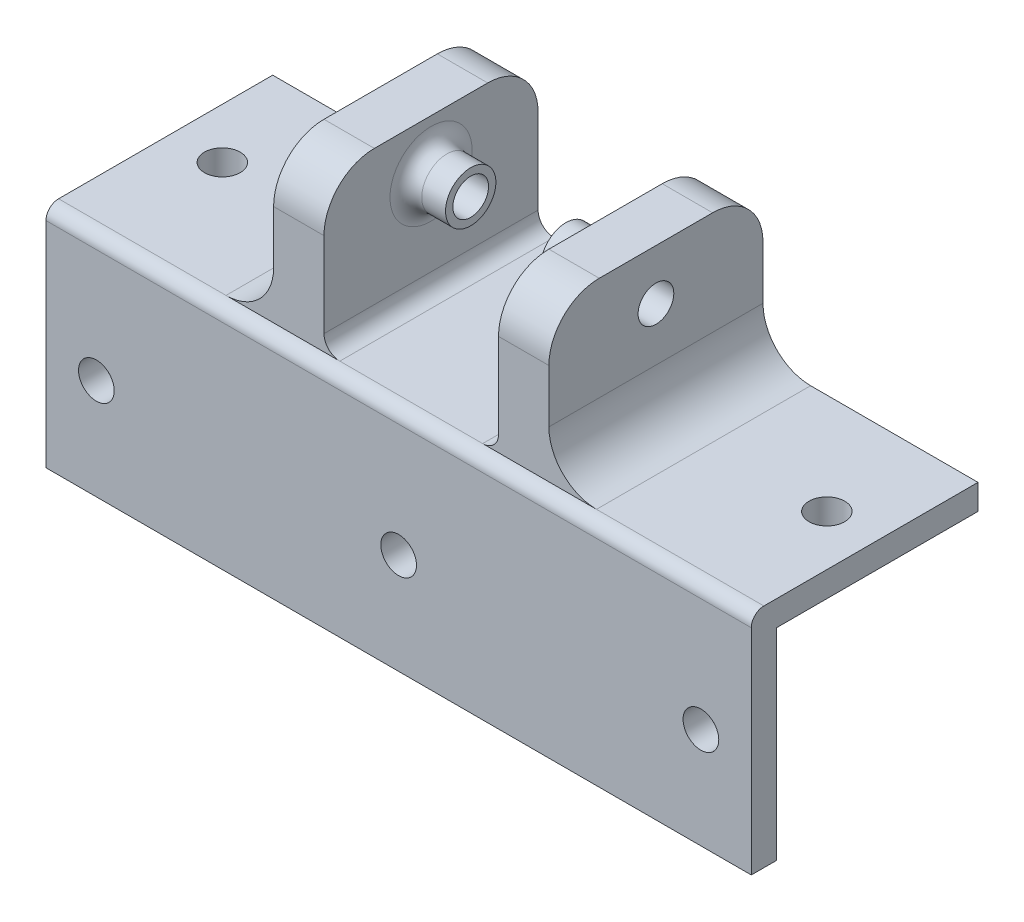
ISO-10303-21;
HEADER;
FILE_DESCRIPTION(('STEP AP214'),'2;1');
FILE_NAME('part.step','',(''),(''),'','','');
FILE_SCHEMA(('AUTOMOTIVE_DESIGN { 1 0 10303 214 1 1 1 1 }'));
ENDSEC;
DATA;
#1=APPLICATION_CONTEXT('core data for automotive mechanical design processes');
#2=APPLICATION_PROTOCOL_DEFINITION('international standard','automotive_design',2000,#1);
#3=PRODUCT_CONTEXT('',#1,'mechanical');
#4=PRODUCT('Part','Part','',(#3));
#5=PRODUCT_RELATED_PRODUCT_CATEGORY('part','',(#4));
#6=PRODUCT_DEFINITION_FORMATION('','',#4);
#7=PRODUCT_DEFINITION_CONTEXT('part definition',#1,'design');
#8=PRODUCT_DEFINITION('design','',#6,#7);
#9=PRODUCT_DEFINITION_SHAPE('','',#8);
#10=(LENGTH_UNIT() NAMED_UNIT(*) SI_UNIT(.MILLI.,.METRE.));
#11=(NAMED_UNIT(*) PLANE_ANGLE_UNIT() SI_UNIT($,.RADIAN.));
#12=(NAMED_UNIT(*) SI_UNIT($,.STERADIAN.) SOLID_ANGLE_UNIT());
#13=UNCERTAINTY_MEASURE_WITH_UNIT(LENGTH_MEASURE(1.E-05),#10,'distance_accuracy_value','');
#14=(GEOMETRIC_REPRESENTATION_CONTEXT(3) GLOBAL_UNCERTAINTY_ASSIGNED_CONTEXT((#13)) GLOBAL_UNIT_ASSIGNED_CONTEXT((#10,
#11,#12)) REPRESENTATION_CONTEXT('',''));
#15=CARTESIAN_POINT('',(0.,0.,0.));
#16=DIRECTION('',(0.,0.,1.));
#17=DIRECTION('',(1.,0.,0.));
#18=AXIS2_PLACEMENT_3D('',#15,#16,#17);
#19=CARTESIAN_POINT('',(-11.,34.925,0.));
#20=DIRECTION('',(1.,0.,0.));
#21=DIRECTION('',(0.,0.,-1.));
#22=AXIS2_PLACEMENT_3D('',#19,#20,#21);
#23=PLANE('',#22);
#24=CARTESIAN_POINT('',(-11.,28.575,-11.90625));
#25=DIRECTION('',(1.,0.,0.));
#26=DIRECTION('',(0.,0.,-1.));
#27=AXIS2_PLACEMENT_3D('',#24,#25,#26);
#28=CIRCLE('',#27,5.175);
#29=CARTESIAN_POINT('',(-11.,28.575,-17.08125));
#30=VERTEX_POINT('',#29);
#31=EDGE_CURVE('E496',#30,#30,#28,.F.);
#32=ORIENTED_EDGE('',*,*,#31,.T.);
#33=EDGE_LOOP('',(#32));
#34=FACE_BOUND('',#33,.T.);
#35=DIRECTION('',(0.,-1.,0.));
#36=VECTOR('',#35,1.);
#37=CARTESIAN_POINT('',(-11.,34.925,1.5875));
#38=LINE('',#37,#36);
#39=CARTESIAN_POINT('',(-11.,28.575,1.5875));
#40=VERTEX_POINT('',#39);
#41=CARTESIAN_POINT('',(-11.,17.875,1.5875));
#42=VERTEX_POINT('',#41);
#43=EDGE_CURVE('E273',#40,#42,#38,.T.);
#44=ORIENTED_EDGE('',*,*,#43,.T.);
#45=DIRECTION('',(0.,0.,1.));
#46=VECTOR('',#45,1.);
#47=CARTESIAN_POINT('',(-11.,17.875,0.));
#48=LINE('',#47,#46);
#49=CARTESIAN_POINT('',(-11.,17.875,-25.4));
#50=VERTEX_POINT('',#49);
#51=EDGE_CURVE('E468',#42,#50,#48,.F.);
#52=ORIENTED_EDGE('',*,*,#51,.T.);
#53=DIRECTION('',(0.,-1.,0.));
#54=VECTOR('',#53,1.);
#55=CARTESIAN_POINT('',(-11.,34.925,-25.4));
#56=LINE('',#55,#54);
#57=CARTESIAN_POINT('',(-11.,28.575,-25.4));
#58=VERTEX_POINT('',#57);
#59=EDGE_CURVE('E276',#58,#50,#56,.T.);
#60=ORIENTED_EDGE('',*,*,#59,.F.);
#61=CARTESIAN_POINT('',(-11.,28.575,-19.05));
#62=DIRECTION('',(1.,0.,0.));
#63=DIRECTION('',(0.,0.,-1.));
#64=AXIS2_PLACEMENT_3D('',#61,#62,#63);
#65=CIRCLE('',#64,6.35);
#66=CARTESIAN_POINT('',(-11.,34.925,-19.05));
#67=VERTEX_POINT('',#66);
#68=EDGE_CURVE('E505',#58,#67,#65,.T.);
#69=ORIENTED_EDGE('',*,*,#68,.T.);
#70=DIRECTION('',(0.,0.,1.));
#71=VECTOR('',#70,1.);
#72=CARTESIAN_POINT('',(-11.,34.925,0.));
#73=LINE('',#72,#71);
#74=CARTESIAN_POINT('',(-11.,34.925,-4.7625));
#75=VERTEX_POINT('',#74);
#76=EDGE_CURVE('E279',#67,#75,#73,.T.);
#77=ORIENTED_EDGE('',*,*,#76,.T.);
#78=CARTESIAN_POINT('',(-11.,28.575,-4.7625));
#79=DIRECTION('',(1.,0.,0.));
#80=DIRECTION('',(0.,0.,-1.));
#81=AXIS2_PLACEMENT_3D('',#78,#79,#80);
#82=CIRCLE('',#81,6.35);
#83=EDGE_CURVE('E507',#75,#40,#82,.T.);
#84=ORIENTED_EDGE('',*,*,#83,.T.);
#85=EDGE_LOOP('',(#44,#52,#60,#69,#77,#84));
#86=FACE_BOUND('',#85,.T.);
#87=ADVANCED_FACE('F41',(#34,#86),#23,.T.);
#88=CARTESIAN_POINT('',(0.,15.875,0.));
#89=DIRECTION('',(0.,-1.,0.));
#90=DIRECTION('',(1.,0.,0.));
#91=AXIS2_PLACEMENT_3D('',#88,#89,#90);
#92=PLANE('',#91);
#93=CARTESIAN_POINT('',(0.,15.875,-12.7));
#94=DIRECTION('',(0.,1.,0.));
#95=DIRECTION('',(-1.,0.,0.));
#96=AXIS2_PLACEMENT_3D('',#93,#94,#95);
#97=CIRCLE('',#96,2.25);
#98=CARTESIAN_POINT('',(-2.25,15.875,-12.7));
#99=VERTEX_POINT('',#98);
#100=EDGE_CURVE('E251',#99,#99,#97,.T.);
#101=ORIENTED_EDGE('',*,*,#100,.F.);
#102=EDGE_LOOP('',(#101));
#103=FACE_BOUND('',#102,.T.);
#104=DIRECTION('',(1.,0.,0.));
#105=VECTOR('',#104,1.);
#106=CARTESIAN_POINT('',(44.45,15.875,1.5875));
#107=LINE('',#106,#105);
#108=CARTESIAN_POINT('',(-9.,15.875,1.5875));
#109=VERTEX_POINT('',#108);
#110=CARTESIAN_POINT('',(9.,15.875,1.5875));
#111=VERTEX_POINT('',#110);
#112=EDGE_CURVE('E544',#109,#111,#107,.T.);
#113=ORIENTED_EDGE('',*,*,#112,.T.);
#114=DIRECTION('',(0.,0.,1.));
#115=VECTOR('',#114,1.);
#116=CARTESIAN_POINT('',(9.,15.875,-25.4));
#117=LINE('',#116,#115);
#118=CARTESIAN_POINT('',(9.,15.875,-25.4));
#119=VERTEX_POINT('',#118);
#120=EDGE_CURVE('E461',#111,#119,#117,.F.);
#121=ORIENTED_EDGE('',*,*,#120,.T.);
#122=DIRECTION('',(-1.,0.,0.));
#123=VECTOR('',#122,1.);
#124=CARTESIAN_POINT('',(-44.45,15.875,-25.4));
#125=LINE('',#124,#123);
#126=CARTESIAN_POINT('',(-9.,15.875,-25.4));
#127=VERTEX_POINT('',#126);
#128=EDGE_CURVE('E220',#119,#127,#125,.T.);
#129=ORIENTED_EDGE('',*,*,#128,.T.);
#130=DIRECTION('',(0.,0.,1.));
#131=VECTOR('',#130,1.);
#132=CARTESIAN_POINT('',(-9.,15.875,0.));
#133=LINE('',#132,#131);
#134=EDGE_CURVE('E473',#127,#109,#133,.T.);
#135=ORIENTED_EDGE('',*,*,#134,.T.);
#136=EDGE_LOOP('',(#113,#121,#129,#135));
#137=FACE_BOUND('',#136,.T.);
#138=ADVANCED_FACE('F348',(#103,#137),#92,.F.);
#139=CARTESIAN_POINT('',(-38.1,15.875,-12.7));
#140=DIRECTION('',(0.,1.,0.));
#141=DIRECTION('',(-1.,0.,0.));
#142=AXIS2_PLACEMENT_3D('',#139,#140,#141);
#143=CIRCLE('',#142,2.25);
#144=CARTESIAN_POINT('',(-40.35,15.875,-12.7));
#145=VERTEX_POINT('',#144);
#146=EDGE_CURVE('E252',#145,#145,#143,.T.);
#147=ORIENTED_EDGE('',*,*,#146,.F.);
#148=EDGE_LOOP('',(#147));
#149=FACE_BOUND('',#148,.T.);
#150=CARTESIAN_POINT('',(-44.45,15.875,1.5875));
#151=VERTEX_POINT('',#150);
#152=CARTESIAN_POINT('',(-23.35,15.875,1.5875));
#153=VERTEX_POINT('',#152);
#154=EDGE_CURVE('E542',#151,#153,#107,.T.);
#155=ORIENTED_EDGE('',*,*,#154,.T.);
#156=DIRECTION('',(0.,0.,1.));
#157=VECTOR('',#156,1.);
#158=CARTESIAN_POINT('',(-23.35,15.875,-25.4));
#159=LINE('',#158,#157);
#160=CARTESIAN_POINT('',(-23.35,15.875,-25.4));
#161=VERTEX_POINT('',#160);
#162=EDGE_CURVE('E235',#153,#161,#159,.F.);
#163=ORIENTED_EDGE('',*,*,#162,.T.);
#164=CARTESIAN_POINT('',(-44.45,15.875,-25.4));
#165=VERTEX_POINT('',#164);
#166=EDGE_CURVE('E202',#161,#165,#125,.T.);
#167=ORIENTED_EDGE('',*,*,#166,.T.);
#168=DIRECTION('',(0.,0.,1.));
#169=VECTOR('',#168,1.);
#170=CARTESIAN_POINT('',(-44.45,15.875,3.175));
#171=LINE('',#170,#169);
#172=EDGE_CURVE('E203',#165,#151,#171,.T.);
#173=ORIENTED_EDGE('',*,*,#172,.T.);
#174=EDGE_LOOP('',(#155,#163,#167,#173));
#175=FACE_BOUND('',#174,.T.);
#176=ADVANCED_FACE('F231',(#149,#175),#92,.F.);
#177=CARTESIAN_POINT('',(0.,0.,3.175));
#178=DIRECTION('',(0.,0.,1.));
#179=DIRECTION('',(1.,0.,0.));
#180=AXIS2_PLACEMENT_3D('',#177,#178,#179);
#181=PLANE('',#180);
#182=CARTESIAN_POINT('',(-38.1,0.,3.175));
#183=DIRECTION('',(0.,0.,1.));
#184=DIRECTION('',(1.,0.,0.));
#185=AXIS2_PLACEMENT_3D('',#182,#183,#184);
#186=CIRCLE('',#185,2.25);
#187=CARTESIAN_POINT('',(-35.85,0.,3.175));
#188=VERTEX_POINT('',#187);
#189=EDGE_CURVE('E572',#188,#188,#186,.T.);
#190=ORIENTED_EDGE('',*,*,#189,.F.);
#191=EDGE_LOOP('',(#190));
#192=FACE_BOUND('',#191,.T.);
#193=DIRECTION('',(0.,1.,0.));
#194=VECTOR('',#193,1.);
#195=CARTESIAN_POINT('',(44.45,-12.7,3.175));
#196=LINE('',#195,#194);
#197=CARTESIAN_POINT('',(44.45,-12.7,3.175));
#198=VERTEX_POINT('',#197);
#199=CARTESIAN_POINT('',(44.45,14.2875,3.175));
#200=VERTEX_POINT('',#199);
#201=EDGE_CURVE('E551',#198,#200,#196,.T.);
#202=ORIENTED_EDGE('',*,*,#201,.T.);
#203=DIRECTION('',(1.,0.,0.));
#204=VECTOR('',#203,1.);
#205=CARTESIAN_POINT('',(-44.45,14.2875,3.175));
#206=LINE('',#205,#204);
#207=CARTESIAN_POINT('',(-44.45,14.2875,3.175));
#208=VERTEX_POINT('',#207);
#209=EDGE_CURVE('E538',#200,#208,#206,.F.);
#210=ORIENTED_EDGE('',*,*,#209,.T.);
#211=DIRECTION('',(0.,-1.,0.));
#212=VECTOR('',#211,1.);
#213=CARTESIAN_POINT('',(-44.45,-12.7,3.175));
#214=LINE('',#213,#212);
#215=CARTESIAN_POINT('',(-44.45,-12.7,3.175));
#216=VERTEX_POINT('',#215);
#217=EDGE_CURVE('E555',#208,#216,#214,.T.);
#218=ORIENTED_EDGE('',*,*,#217,.T.);
#219=DIRECTION('',(1.,0.,0.));
#220=VECTOR('',#219,1.);
#221=CARTESIAN_POINT('',(44.45,-12.7,3.175));
#222=LINE('',#221,#220);
#223=EDGE_CURVE('E566',#216,#198,#222,.T.);
#224=ORIENTED_EDGE('',*,*,#223,.T.);
#225=EDGE_LOOP('',(#202,#210,#218,#224));
#226=FACE_BOUND('',#225,.T.);
#227=CARTESIAN_POINT('',(0.,0.,3.175));
#228=DIRECTION('',(0.,0.,1.));
#229=DIRECTION('',(1.,0.,0.));
#230=AXIS2_PLACEMENT_3D('',#227,#228,#229);
#231=CIRCLE('',#230,2.25);
#232=CARTESIAN_POINT('',(2.25,0.,3.175));
#233=VERTEX_POINT('',#232);
#234=EDGE_CURVE('E563',#233,#233,#231,.T.);
#235=ORIENTED_EDGE('',*,*,#234,.F.);
#236=EDGE_LOOP('',(#235));
#237=FACE_BOUND('',#236,.T.);
#238=CARTESIAN_POINT('',(38.1,0.,3.175));
#239=DIRECTION('',(0.,0.,1.));
#240=DIRECTION('',(1.,0.,0.));
#241=AXIS2_PLACEMENT_3D('',#238,#239,#240);
#242=CIRCLE('',#241,2.25);
#243=CARTESIAN_POINT('',(40.35,0.,3.175));
#244=VERTEX_POINT('',#243);
#245=EDGE_CURVE('E578',#244,#244,#242,.T.);
#246=ORIENTED_EDGE('',*,*,#245,.F.);
#247=EDGE_LOOP('',(#246));
#248=FACE_BOUND('',#247,.T.);
#249=ADVANCED_FACE('F403',(#192,#226,#237,#248),#181,.T.);
#250=CARTESIAN_POINT('',(0.,0.,0.));
#251=DIRECTION('',(0.,0.,1.));
#252=DIRECTION('',(1.,0.,0.));
#253=AXIS2_PLACEMENT_3D('',#250,#251,#252);
#254=PLANE('',#253);
#255=DIRECTION('',(0.,-1.,0.));
#256=VECTOR('',#255,1.);
#257=CARTESIAN_POINT('',(-44.45,-12.7,0.));
#258=LINE('',#257,#256);
#259=CARTESIAN_POINT('',(-44.45,12.7,0.));
#260=VERTEX_POINT('',#259);
#261=CARTESIAN_POINT('',(-44.45,-12.7,0.));
#262=VERTEX_POINT('',#261);
#263=EDGE_CURVE('E560',#260,#262,#258,.T.);
#264=ORIENTED_EDGE('',*,*,#263,.F.);
#265=DIRECTION('',(-1.,0.,0.));
#266=VECTOR('',#265,1.);
#267=CARTESIAN_POINT('',(44.45,12.7,0.));
#268=LINE('',#267,#266);
#269=CARTESIAN_POINT('',(44.45,12.7,0.));
#270=VERTEX_POINT('',#269);
#271=EDGE_CURVE('E552',#270,#260,#268,.T.);
#272=ORIENTED_EDGE('',*,*,#271,.F.);
#273=DIRECTION('',(0.,1.,0.));
#274=VECTOR('',#273,1.);
#275=CARTESIAN_POINT('',(44.45,-12.7,0.));
#276=LINE('',#275,#274);
#277=CARTESIAN_POINT('',(44.45,-12.7,0.));
#278=VERTEX_POINT('',#277);
#279=EDGE_CURVE('E556',#278,#270,#276,.T.);
#280=ORIENTED_EDGE('',*,*,#279,.F.);
#281=DIRECTION('',(1.,0.,0.));
#282=VECTOR('',#281,1.);
#283=CARTESIAN_POINT('',(44.45,-12.7,0.));
#284=LINE('',#283,#282);
#285=EDGE_CURVE('E558',#262,#278,#284,.T.);
#286=ORIENTED_EDGE('',*,*,#285,.F.);
#287=EDGE_LOOP('',(#264,#272,#280,#286));
#288=FACE_BOUND('',#287,.T.);
#289=CARTESIAN_POINT('',(0.,0.,0.));
#290=DIRECTION('',(0.,0.,1.));
#291=DIRECTION('',(1.,0.,0.));
#292=AXIS2_PLACEMENT_3D('',#289,#290,#291);
#293=CIRCLE('',#292,2.25);
#294=CARTESIAN_POINT('',(2.25,0.,0.));
#295=VERTEX_POINT('',#294);
#296=EDGE_CURVE('E569',#295,#295,#293,.T.);
#297=ORIENTED_EDGE('',*,*,#296,.T.);
#298=EDGE_LOOP('',(#297));
#299=FACE_BOUND('',#298,.T.);
#300=CARTESIAN_POINT('',(-38.1,0.,0.));
#301=DIRECTION('',(0.,0.,1.));
#302=DIRECTION('',(1.,0.,0.));
#303=AXIS2_PLACEMENT_3D('',#300,#301,#302);
#304=CIRCLE('',#303,2.25);
#305=CARTESIAN_POINT('',(-35.85,0.,0.));
#306=VERTEX_POINT('',#305);
#307=EDGE_CURVE('E575',#306,#306,#304,.T.);
#308=ORIENTED_EDGE('',*,*,#307,.T.);
#309=EDGE_LOOP('',(#308));
#310=FACE_BOUND('',#309,.T.);
#311=CARTESIAN_POINT('',(38.1,0.,0.));
#312=DIRECTION('',(0.,0.,1.));
#313=DIRECTION('',(1.,0.,0.));
#314=AXIS2_PLACEMENT_3D('',#311,#312,#313);
#315=CIRCLE('',#314,2.25);
#316=CARTESIAN_POINT('',(40.35,0.,0.));
#317=VERTEX_POINT('',#316);
#318=EDGE_CURVE('E212',#317,#317,#315,.T.);
#319=ORIENTED_EDGE('',*,*,#318,.T.);
#320=EDGE_LOOP('',(#319));
#321=FACE_BOUND('',#320,.T.);
#322=ADVANCED_FACE('F406',(#288,#299,#310,#321),#254,.F.);
#323=CARTESIAN_POINT('',(-44.45,-12.7,3.175));
#324=DIRECTION('',(1.,0.,0.));
#325=DIRECTION('',(0.,0.,-1.));
#326=AXIS2_PLACEMENT_3D('',#323,#324,#325);
#327=PLANE('',#326);
#328=ORIENTED_EDGE('',*,*,#217,.F.);
#329=CARTESIAN_POINT('',(-44.45,14.2875,1.5875));
#330=DIRECTION('',(1.,0.,0.));
#331=DIRECTION('',(0.,0.,-1.));
#332=AXIS2_PLACEMENT_3D('',#329,#330,#331);
#333=CIRCLE('',#332,1.5875);
#334=EDGE_CURVE('E244',#208,#151,#333,.F.);
#335=ORIENTED_EDGE('',*,*,#334,.T.);
#336=ORIENTED_EDGE('',*,*,#172,.F.);
#337=DIRECTION('',(0.,-1.,0.));
#338=VECTOR('',#337,1.);
#339=CARTESIAN_POINT('',(-44.45,15.875,-25.4));
#340=LINE('',#339,#338);
#341=CARTESIAN_POINT('',(-44.45,12.7,-25.4));
#342=VERTEX_POINT('',#341);
#343=EDGE_CURVE('E213',#165,#342,#340,.T.);
#344=ORIENTED_EDGE('',*,*,#343,.T.);
#345=DIRECTION('',(0.,0.,1.));
#346=VECTOR('',#345,1.);
#347=CARTESIAN_POINT('',(-44.45,12.7,3.175));
#348=LINE('',#347,#346);
#349=EDGE_CURVE('E255',#342,#260,#348,.T.);
#350=ORIENTED_EDGE('',*,*,#349,.T.);
#351=ORIENTED_EDGE('',*,*,#263,.T.);
#352=DIRECTION('',(0.,0.,-1.));
#353=VECTOR('',#352,1.);
#354=CARTESIAN_POINT('',(-44.45,-12.7,3.175));
#355=LINE('',#354,#353);
#356=EDGE_CURVE('E545',#216,#262,#355,.T.);
#357=ORIENTED_EDGE('',*,*,#356,.F.);
#358=EDGE_LOOP('',(#328,#335,#336,#344,#350,#351,#357));
#359=FACE_BOUND('',#358,.T.);
#360=ADVANCED_FACE('F242',(#359),#327,.F.);
#361=CARTESIAN_POINT('',(44.45,-12.7,3.175));
#362=DIRECTION('',(0.,1.,0.));
#363=DIRECTION('',(-1.,0.,0.));
#364=AXIS2_PLACEMENT_3D('',#361,#362,#363);
#365=PLANE('',#364);
#366=ORIENTED_EDGE('',*,*,#285,.T.);
#367=DIRECTION('',(0.,0.,-1.));
#368=VECTOR('',#367,1.);
#369=CARTESIAN_POINT('',(44.45,-12.7,3.175));
#370=LINE('',#369,#368);
#371=EDGE_CURVE('E548',#198,#278,#370,.T.);
#372=ORIENTED_EDGE('',*,*,#371,.F.);
#373=ORIENTED_EDGE('',*,*,#223,.F.);
#374=ORIENTED_EDGE('',*,*,#356,.T.);
#375=EDGE_LOOP('',(#366,#372,#373,#374));
#376=FACE_BOUND('',#375,.T.);
#377=ADVANCED_FACE('F413',(#376),#365,.F.);
#378=CARTESIAN_POINT('',(44.45,-12.7,3.175));
#379=DIRECTION('',(-1.,0.,0.));
#380=DIRECTION('',(0.,0.,1.));
#381=AXIS2_PLACEMENT_3D('',#378,#379,#380);
#382=PLANE('',#381);
#383=DIRECTION('',(0.,0.,-1.));
#384=VECTOR('',#383,1.);
#385=CARTESIAN_POINT('',(44.45,15.875,3.175));
#386=LINE('',#385,#384);
#387=CARTESIAN_POINT('',(44.45,15.875,1.5875));
#388=VERTEX_POINT('',#387);
#389=CARTESIAN_POINT('',(44.45,15.875,-25.4));
#390=VERTEX_POINT('',#389);
#391=EDGE_CURVE('E191',#388,#390,#386,.T.);
#392=ORIENTED_EDGE('',*,*,#391,.F.);
#393=CARTESIAN_POINT('',(44.45,14.2875,1.5875));
#394=DIRECTION('',(-1.,0.,0.));
#395=DIRECTION('',(0.,0.,1.));
#396=AXIS2_PLACEMENT_3D('',#393,#394,#395);
#397=CIRCLE('',#396,1.5875);
#398=EDGE_CURVE('E540',#388,#200,#397,.F.);
#399=ORIENTED_EDGE('',*,*,#398,.T.);
#400=ORIENTED_EDGE('',*,*,#201,.F.);
#401=ORIENTED_EDGE('',*,*,#371,.T.);
#402=ORIENTED_EDGE('',*,*,#279,.T.);
#403=DIRECTION('',(0.,0.,-1.));
#404=VECTOR('',#403,1.);
#405=CARTESIAN_POINT('',(44.45,12.7,3.175));
#406=LINE('',#405,#404);
#407=CARTESIAN_POINT('',(44.45,12.7,-25.4));
#408=VERTEX_POINT('',#407);
#409=EDGE_CURVE('E209',#270,#408,#406,.T.);
#410=ORIENTED_EDGE('',*,*,#409,.T.);
#411=DIRECTION('',(0.,-1.,0.));
#412=VECTOR('',#411,1.);
#413=CARTESIAN_POINT('',(44.45,15.875,-25.4));
#414=LINE('',#413,#412);
#415=EDGE_CURVE('E206',#390,#408,#414,.T.);
#416=ORIENTED_EDGE('',*,*,#415,.F.);
#417=EDGE_LOOP('',(#392,#399,#400,#401,#402,#410,#416));
#418=FACE_BOUND('',#417,.T.);
#419=ADVANCED_FACE('F207',(#418),#382,.F.);
#420=CARTESIAN_POINT('',(0.,0.,3.175));
#421=DIRECTION('',(0.,0.,-1.));
#422=DIRECTION('',(-1.,0.,0.));
#423=AXIS2_PLACEMENT_3D('',#420,#421,#422);
#424=CYLINDRICAL_SURFACE('',#423,2.25);
#425=ORIENTED_EDGE('',*,*,#234,.T.);
#426=EDGE_LOOP('',(#425));
#427=FACE_BOUND('',#426,.T.);
#428=ORIENTED_EDGE('',*,*,#296,.F.);
#429=EDGE_LOOP('',(#428));
#430=FACE_BOUND('',#429,.T.);
#431=ADVANCED_FACE('F398',(#427,#430),#424,.F.);
#432=CARTESIAN_POINT('',(-38.1,0.,3.175));
#433=DIRECTION('',(0.,0.,-1.));
#434=DIRECTION('',(-1.,0.,0.));
#435=AXIS2_PLACEMENT_3D('',#432,#433,#434);
#436=CYLINDRICAL_SURFACE('',#435,2.25);
#437=ORIENTED_EDGE('',*,*,#189,.T.);
#438=EDGE_LOOP('',(#437));
#439=FACE_BOUND('',#438,.T.);
#440=ORIENTED_EDGE('',*,*,#307,.F.);
#441=EDGE_LOOP('',(#440));
#442=FACE_BOUND('',#441,.T.);
#443=ADVANCED_FACE('F394',(#439,#442),#436,.F.);
#444=CARTESIAN_POINT('',(38.1,0.,3.175));
#445=DIRECTION('',(0.,0.,-1.));
#446=DIRECTION('',(-1.,0.,0.));
#447=AXIS2_PLACEMENT_3D('',#444,#445,#446);
#448=CYLINDRICAL_SURFACE('',#447,2.25);
#449=ORIENTED_EDGE('',*,*,#245,.T.);
#450=EDGE_LOOP('',(#449));
#451=FACE_BOUND('',#450,.T.);
#452=ORIENTED_EDGE('',*,*,#318,.F.);
#453=EDGE_LOOP('',(#452));
#454=FACE_BOUND('',#453,.T.);
#455=ADVANCED_FACE('F386',(#451,#454),#448,.F.);
#456=CARTESIAN_POINT('',(23.35,15.875,-25.4));
#457=VERTEX_POINT('',#456);
#458=EDGE_CURVE('E197',#390,#457,#125,.T.);
#459=ORIENTED_EDGE('',*,*,#458,.T.);
#460=DIRECTION('',(0.,0.,1.));
#461=VECTOR('',#460,1.);
#462=CARTESIAN_POINT('',(23.35,15.875,0.));
#463=LINE('',#462,#461);
#464=CARTESIAN_POINT('',(23.35,15.875,1.5875));
#465=VERTEX_POINT('',#464);
#466=EDGE_CURVE('E491',#457,#465,#463,.T.);
#467=ORIENTED_EDGE('',*,*,#466,.T.);
#468=EDGE_CURVE('E199',#465,#388,#107,.T.);
#469=ORIENTED_EDGE('',*,*,#468,.T.);
#470=ORIENTED_EDGE('',*,*,#391,.T.);
#471=EDGE_LOOP('',(#459,#467,#469,#470));
#472=FACE_BOUND('',#471,.T.);
#473=CARTESIAN_POINT('',(38.1,15.875,-12.7));
#474=DIRECTION('',(0.,1.,0.));
#475=DIRECTION('',(-1.,0.,0.));
#476=AXIS2_PLACEMENT_3D('',#473,#474,#475);
#477=CIRCLE('',#476,2.25);
#478=CARTESIAN_POINT('',(35.85,15.875,-12.7));
#479=VERTEX_POINT('',#478);
#480=EDGE_CURVE('E259',#479,#479,#477,.T.);
#481=ORIENTED_EDGE('',*,*,#480,.F.);
#482=EDGE_LOOP('',(#481));
#483=FACE_BOUND('',#482,.T.);
#484=ADVANCED_FACE('F193',(#472,#483),#92,.F.);
#485=CARTESIAN_POINT('',(0.,12.7,0.));
#486=DIRECTION('',(0.,-1.,0.));
#487=DIRECTION('',(1.,0.,0.));
#488=AXIS2_PLACEMENT_3D('',#485,#486,#487);
#489=PLANE('',#488);
#490=CARTESIAN_POINT('',(-38.1,12.7,-12.7));
#491=DIRECTION('',(0.,1.,0.));
#492=DIRECTION('',(-1.,0.,0.));
#493=AXIS2_PLACEMENT_3D('',#490,#491,#492);
#494=CIRCLE('',#493,2.25);
#495=CARTESIAN_POINT('',(-40.35,12.7,-12.7));
#496=VERTEX_POINT('',#495);
#497=EDGE_CURVE('E256',#496,#496,#494,.T.);
#498=ORIENTED_EDGE('',*,*,#497,.T.);
#499=EDGE_LOOP('',(#498));
#500=FACE_BOUND('',#499,.T.);
#501=ORIENTED_EDGE('',*,*,#409,.F.);
#502=ORIENTED_EDGE('',*,*,#271,.T.);
#503=ORIENTED_EDGE('',*,*,#349,.F.);
#504=DIRECTION('',(-1.,0.,0.));
#505=VECTOR('',#504,1.);
#506=CARTESIAN_POINT('',(-44.45,12.7,-25.4));
#507=LINE('',#506,#505);
#508=EDGE_CURVE('E237',#408,#342,#507,.T.);
#509=ORIENTED_EDGE('',*,*,#508,.F.);
#510=EDGE_LOOP('',(#501,#502,#503,#509));
#511=FACE_BOUND('',#510,.T.);
#512=CARTESIAN_POINT('',(0.,12.7,-12.7));
#513=DIRECTION('',(0.,1.,0.));
#514=DIRECTION('',(-1.,0.,0.));
#515=AXIS2_PLACEMENT_3D('',#512,#513,#514);
#516=CIRCLE('',#515,2.25);
#517=CARTESIAN_POINT('',(-2.25,12.7,-12.7));
#518=VERTEX_POINT('',#517);
#519=EDGE_CURVE('E248',#518,#518,#516,.T.);
#520=ORIENTED_EDGE('',*,*,#519,.T.);
#521=EDGE_LOOP('',(#520));
#522=FACE_BOUND('',#521,.T.);
#523=CARTESIAN_POINT('',(38.1,12.7,-12.7));
#524=DIRECTION('',(0.,1.,0.));
#525=DIRECTION('',(-1.,0.,0.));
#526=AXIS2_PLACEMENT_3D('',#523,#524,#525);
#527=CIRCLE('',#526,2.25);
#528=CARTESIAN_POINT('',(35.85,12.7,-12.7));
#529=VERTEX_POINT('',#528);
#530=EDGE_CURVE('E262',#529,#529,#527,.T.);
#531=ORIENTED_EDGE('',*,*,#530,.T.);
#532=EDGE_LOOP('',(#531));
#533=FACE_BOUND('',#532,.T.);
#534=ADVANCED_FACE('F385',(#500,#511,#522,#533),#489,.T.);
#535=CARTESIAN_POINT('',(-44.45,15.875,-25.4));
#536=DIRECTION('',(0.,0.,1.));
#537=DIRECTION('',(1.,0.,0.));
#538=AXIS2_PLACEMENT_3D('',#535,#536,#537);
#539=PLANE('',#538);
#540=DIRECTION('',(0.,-1.,0.));
#541=VECTOR('',#540,1.);
#542=CARTESIAN_POINT('',(11.,34.925,-25.4));
#543=LINE('',#542,#541);
#544=CARTESIAN_POINT('',(11.,28.575,-25.4));
#545=VERTEX_POINT('',#544);
#546=CARTESIAN_POINT('',(11.,17.875,-25.4));
#547=VERTEX_POINT('',#546);
#548=EDGE_CURVE('E290',#545,#547,#543,.T.);
#549=ORIENTED_EDGE('',*,*,#548,.F.);
#550=DIRECTION('',(-1.,0.,0.));
#551=VECTOR('',#550,1.);
#552=CARTESIAN_POINT('',(17.35,28.575,-25.4));
#553=LINE('',#552,#551);
#554=CARTESIAN_POINT('',(17.35,28.575,-25.4));
#555=VERTEX_POINT('',#554);
#556=EDGE_CURVE('E523',#545,#555,#553,.F.);
#557=ORIENTED_EDGE('',*,*,#556,.T.);
#558=DIRECTION('',(0.,-1.,0.));
#559=VECTOR('',#558,1.);
#560=CARTESIAN_POINT('',(17.35,34.925,-25.4));
#561=LINE('',#560,#559);
#562=CARTESIAN_POINT('',(17.35,21.875,-25.4));
#563=VERTEX_POINT('',#562);
#564=EDGE_CURVE('E284',#555,#563,#561,.T.);
#565=ORIENTED_EDGE('',*,*,#564,.T.);
#566=CARTESIAN_POINT('',(23.35,21.875,-25.4));
#567=DIRECTION('',(0.,0.,1.));
#568=DIRECTION('',(1.,0.,0.));
#569=AXIS2_PLACEMENT_3D('',#566,#567,#568);
#570=CIRCLE('',#569,6.);
#571=EDGE_CURVE('E219',#563,#457,#570,.T.);
#572=ORIENTED_EDGE('',*,*,#571,.T.);
#573=ORIENTED_EDGE('',*,*,#458,.F.);
#574=ORIENTED_EDGE('',*,*,#415,.T.);
#575=ORIENTED_EDGE('',*,*,#508,.T.);
#576=ORIENTED_EDGE('',*,*,#343,.F.);
#577=ORIENTED_EDGE('',*,*,#166,.F.);
#578=CARTESIAN_POINT('',(-23.35,21.875,-25.4));
#579=DIRECTION('',(0.,0.,1.));
#580=DIRECTION('',(1.,0.,0.));
#581=AXIS2_PLACEMENT_3D('',#578,#579,#580);
#582=CIRCLE('',#581,6.);
#583=CARTESIAN_POINT('',(-17.35,21.875,-25.4));
#584=VERTEX_POINT('',#583);
#585=EDGE_CURVE('E477',#161,#584,#582,.T.);
#586=ORIENTED_EDGE('',*,*,#585,.T.);
#587=DIRECTION('',(0.,-1.,0.));
#588=VECTOR('',#587,1.);
#589=CARTESIAN_POINT('',(-17.35,34.925,-25.4));
#590=LINE('',#589,#588);
#591=CARTESIAN_POINT('',(-17.35,28.575,-25.4));
#592=VERTEX_POINT('',#591);
#593=EDGE_CURVE('E265',#592,#584,#590,.T.);
#594=ORIENTED_EDGE('',*,*,#593,.F.);
#595=DIRECTION('',(-1.,0.,0.));
#596=VECTOR('',#595,1.);
#597=CARTESIAN_POINT('',(-11.,28.575,-25.4));
#598=LINE('',#597,#596);
#599=EDGE_CURVE('E525',#592,#58,#598,.F.);
#600=ORIENTED_EDGE('',*,*,#599,.T.);
#601=ORIENTED_EDGE('',*,*,#59,.T.);
#602=CARTESIAN_POINT('',(-9.00000000000001,17.875,-25.4));
#603=DIRECTION('',(0.,0.,1.));
#604=DIRECTION('',(1.,0.,0.));
#605=AXIS2_PLACEMENT_3D('',#602,#603,#604);
#606=CIRCLE('',#605,2.);
#607=EDGE_CURVE('E11',#50,#127,#606,.T.);
#608=ORIENTED_EDGE('',*,*,#607,.T.);
#609=ORIENTED_EDGE('',*,*,#128,.F.);
#610=CARTESIAN_POINT('',(9.,17.875,-25.4));
#611=DIRECTION('',(0.,0.,1.));
#612=DIRECTION('',(1.,0.,0.));
#613=AXIS2_PLACEMENT_3D('',#610,#611,#612);
#614=CIRCLE('',#613,2.);
#615=EDGE_CURVE('E460',#119,#547,#614,.T.);
#616=ORIENTED_EDGE('',*,*,#615,.T.);
#617=EDGE_LOOP('',(#549,#557,#565,#572,#573,#574,#575,#576,#577,#586,#594,#600,#601,#608,#609,#616));
#618=FACE_BOUND('',#617,.T.);
#619=ADVANCED_FACE('F216',(#618),#539,.F.);
#620=CARTESIAN_POINT('',(0.,15.875,-12.7));
#621=DIRECTION('',(0.,-1.,0.));
#622=DIRECTION('',(1.,0.,0.));
#623=AXIS2_PLACEMENT_3D('',#620,#621,#622);
#624=CYLINDRICAL_SURFACE('',#623,2.25);
#625=ORIENTED_EDGE('',*,*,#100,.T.);
#626=EDGE_LOOP('',(#625));
#627=FACE_BOUND('',#626,.T.);
#628=ORIENTED_EDGE('',*,*,#519,.F.);
#629=EDGE_LOOP('',(#628));
#630=FACE_BOUND('',#629,.T.);
#631=ADVANCED_FACE('F379',(#627,#630),#624,.F.);
#632=CARTESIAN_POINT('',(-38.1,15.875,-12.7));
#633=DIRECTION('',(0.,-1.,0.));
#634=DIRECTION('',(1.,0.,0.));
#635=AXIS2_PLACEMENT_3D('',#632,#633,#634);
#636=CYLINDRICAL_SURFACE('',#635,2.25);
#637=ORIENTED_EDGE('',*,*,#146,.T.);
#638=EDGE_LOOP('',(#637));
#639=FACE_BOUND('',#638,.T.);
#640=ORIENTED_EDGE('',*,*,#497,.F.);
#641=EDGE_LOOP('',(#640));
#642=FACE_BOUND('',#641,.T.);
#643=ADVANCED_FACE('F375',(#639,#642),#636,.F.);
#644=CARTESIAN_POINT('',(38.1,15.875,-12.7));
#645=DIRECTION('',(0.,-1.,0.));
#646=DIRECTION('',(1.,0.,0.));
#647=AXIS2_PLACEMENT_3D('',#644,#645,#646);
#648=CYLINDRICAL_SURFACE('',#647,2.25);
#649=ORIENTED_EDGE('',*,*,#480,.T.);
#650=EDGE_LOOP('',(#649));
#651=FACE_BOUND('',#650,.T.);
#652=ORIENTED_EDGE('',*,*,#530,.F.);
#653=EDGE_LOOP('',(#652));
#654=FACE_BOUND('',#653,.T.);
#655=ADVANCED_FACE('F372',(#651,#654),#648,.F.);
#656=CARTESIAN_POINT('',(0.,14.2875,1.5875));
#657=DIRECTION('',(-1.,0.,0.));
#658=DIRECTION('',(0.,-1.,0.));
#659=AXIS2_PLACEMENT_3D('',#656,#657,#658);
#660=CYLINDRICAL_SURFACE('',#659,1.5875);
#661=ORIENTED_EDGE('',*,*,#334,.F.);
#662=ORIENTED_EDGE('',*,*,#209,.F.);
#663=ORIENTED_EDGE('',*,*,#398,.F.);
#664=ORIENTED_EDGE('',*,*,#468,.F.);
#665=DIRECTION('',(1.,0.,0.));
#666=VECTOR('',#665,1.);
#667=CARTESIAN_POINT('',(0.,15.875,1.5875));
#668=LINE('',#667,#666);
#669=EDGE_CURVE('E57',#111,#465,#668,.T.);
#670=ORIENTED_EDGE('',*,*,#669,.F.);
#671=ORIENTED_EDGE('',*,*,#112,.F.);
#672=DIRECTION('',(1.,0.,0.));
#673=VECTOR('',#672,1.);
#674=CARTESIAN_POINT('',(0.,15.875,1.5875));
#675=LINE('',#674,#673);
#676=EDGE_CURVE('E280',#153,#109,#675,.T.);
#677=ORIENTED_EDGE('',*,*,#676,.F.);
#678=ORIENTED_EDGE('',*,*,#154,.F.);
#679=EDGE_LOOP('',(#661,#662,#663,#664,#670,#671,#677,#678));
#680=FACE_BOUND('',#679,.T.);
#681=ADVANCED_FACE('F370',(#680),#660,.T.);
#682=CARTESIAN_POINT('',(-17.35,34.925,0.));
#683=DIRECTION('',(1.,0.,0.));
#684=DIRECTION('',(0.,1.,0.));
#685=AXIS2_PLACEMENT_3D('',#682,#683,#684);
#686=PLANE('',#685);
#687=CARTESIAN_POINT('',(-17.35,28.575,-11.90625));
#688=DIRECTION('',(1.,0.,0.));
#689=DIRECTION('',(0.,1.,0.));
#690=AXIS2_PLACEMENT_3D('',#687,#688,#689);
#691=CIRCLE('',#690,2.25000000000001);
#692=CARTESIAN_POINT('',(-17.35,30.825,-11.90625));
#693=VERTEX_POINT('',#692);
#694=EDGE_CURVE('E302',#693,#693,#691,.T.);
#695=ORIENTED_EDGE('',*,*,#694,.T.);
#696=EDGE_LOOP('',(#695));
#697=FACE_BOUND('',#696,.T.);
#698=ORIENTED_EDGE('',*,*,#593,.T.);
#699=DIRECTION('',(0.,0.,1.));
#700=VECTOR('',#699,1.);
#701=CARTESIAN_POINT('',(-17.35,21.875,1.5875));
#702=LINE('',#701,#700);
#703=CARTESIAN_POINT('',(-17.35,21.875,1.5875));
#704=VERTEX_POINT('',#703);
#705=EDGE_CURVE('E486',#584,#704,#702,.T.);
#706=ORIENTED_EDGE('',*,*,#705,.T.);
#707=DIRECTION('',(0.,-1.,0.));
#708=VECTOR('',#707,1.);
#709=CARTESIAN_POINT('',(-17.35,34.925,1.5875));
#710=LINE('',#709,#708);
#711=CARTESIAN_POINT('',(-17.35,28.575,1.5875));
#712=VERTEX_POINT('',#711);
#713=EDGE_CURVE('E270',#712,#704,#710,.T.);
#714=ORIENTED_EDGE('',*,*,#713,.F.);
#715=CARTESIAN_POINT('',(-17.35,28.575,-4.7625));
#716=DIRECTION('',(1.,0.,0.));
#717=DIRECTION('',(0.,1.,0.));
#718=AXIS2_PLACEMENT_3D('',#715,#716,#717);
#719=CIRCLE('',#718,6.35);
#720=CARTESIAN_POINT('',(-17.35,34.925,-4.7625));
#721=VERTEX_POINT('',#720);
#722=EDGE_CURVE('E511',#712,#721,#719,.F.);
#723=ORIENTED_EDGE('',*,*,#722,.T.);
#724=DIRECTION('',(0.,0.,1.));
#725=VECTOR('',#724,1.);
#726=CARTESIAN_POINT('',(-17.35,34.925,0.));
#727=LINE('',#726,#725);
#728=CARTESIAN_POINT('',(-17.35,34.925,-19.05));
#729=VERTEX_POINT('',#728);
#730=EDGE_CURVE('E283',#729,#721,#727,.T.);
#731=ORIENTED_EDGE('',*,*,#730,.F.);
#732=CARTESIAN_POINT('',(-17.35,28.575,-19.05));
#733=DIRECTION('',(1.,0.,0.));
#734=DIRECTION('',(0.,1.,0.));
#735=AXIS2_PLACEMENT_3D('',#732,#733,#734);
#736=CIRCLE('',#735,6.35);
#737=EDGE_CURVE('E509',#729,#592,#736,.F.);
#738=ORIENTED_EDGE('',*,*,#737,.T.);
#739=EDGE_LOOP('',(#698,#706,#714,#723,#731,#738));
#740=FACE_BOUND('',#739,.T.);
#741=ADVANCED_FACE('F366',(#697,#740),#686,.F.);
#742=CARTESIAN_POINT('',(0.,34.925,1.5875));
#743=DIRECTION('',(0.,0.,-1.));
#744=DIRECTION('',(-1.,0.,0.));
#745=AXIS2_PLACEMENT_3D('',#742,#743,#744);
#746=PLANE('',#745);
#747=ORIENTED_EDGE('',*,*,#43,.F.);
#748=DIRECTION('',(1.,0.,0.));
#749=VECTOR('',#748,1.);
#750=CARTESIAN_POINT('',(-17.35,28.575,1.5875));
#751=LINE('',#750,#749);
#752=EDGE_CURVE('E503',#40,#712,#751,.F.);
#753=ORIENTED_EDGE('',*,*,#752,.T.);
#754=ORIENTED_EDGE('',*,*,#713,.T.);
#755=CARTESIAN_POINT('',(-23.35,21.875,1.5875));
#756=DIRECTION('',(0.,0.,-1.));
#757=DIRECTION('',(-1.,0.,0.));
#758=AXIS2_PLACEMENT_3D('',#755,#756,#757);
#759=CIRCLE('',#758,6.);
#760=EDGE_CURVE('E479',#704,#153,#759,.T.);
#761=ORIENTED_EDGE('',*,*,#760,.T.);
#762=ORIENTED_EDGE('',*,*,#676,.T.);
#763=CARTESIAN_POINT('',(-9.,17.875,1.5875));
#764=DIRECTION('',(0.,0.,-1.));
#765=DIRECTION('',(-1.,0.,0.));
#766=AXIS2_PLACEMENT_3D('',#763,#764,#765);
#767=CIRCLE('',#766,2.);
#768=EDGE_CURVE('E50',#109,#42,#767,.T.);
#769=ORIENTED_EDGE('',*,*,#768,.T.);
#770=EDGE_LOOP('',(#747,#753,#754,#761,#762,#769));
#771=FACE_BOUND('',#770,.T.);
#772=ADVANCED_FACE('F363',(#771),#746,.F.);
#773=CARTESIAN_POINT('',(0.,34.925,0.));
#774=DIRECTION('',(0.,1.,0.));
#775=DIRECTION('',(-1.,0.,0.));
#776=AXIS2_PLACEMENT_3D('',#773,#774,#775);
#777=PLANE('',#776);
#778=ORIENTED_EDGE('',*,*,#76,.F.);
#779=DIRECTION('',(-1.,0.,0.));
#780=VECTOR('',#779,1.);
#781=CARTESIAN_POINT('',(-17.35,34.925,-19.05));
#782=LINE('',#781,#780);
#783=EDGE_CURVE('E513',#67,#729,#782,.T.);
#784=ORIENTED_EDGE('',*,*,#783,.T.);
#785=ORIENTED_EDGE('',*,*,#730,.T.);
#786=DIRECTION('',(1.,0.,0.));
#787=VECTOR('',#786,1.);
#788=CARTESIAN_POINT('',(-11.,34.925,-4.7625));
#789=LINE('',#788,#787);
#790=EDGE_CURVE('E516',#721,#75,#789,.T.);
#791=ORIENTED_EDGE('',*,*,#790,.T.);
#792=EDGE_LOOP('',(#778,#784,#785,#791));
#793=FACE_BOUND('',#792,.T.);
#794=ADVANCED_FACE('F361',(#793),#777,.T.);
#795=CARTESIAN_POINT('',(17.35,34.925,0.));
#796=DIRECTION('',(1.,0.,0.));
#797=DIRECTION('',(0.,1.,0.));
#798=AXIS2_PLACEMENT_3D('',#795,#796,#797);
#799=PLANE('',#798);
#800=CARTESIAN_POINT('',(17.35,28.575,-11.90625));
#801=DIRECTION('',(1.,0.,0.));
#802=DIRECTION('',(0.,1.,0.));
#803=AXIS2_PLACEMENT_3D('',#800,#801,#802);
#804=CIRCLE('',#803,2.25000000000001);
#805=CARTESIAN_POINT('',(17.35,30.825,-11.90625));
#806=VERTEX_POINT('',#805);
#807=EDGE_CURVE('E309',#806,#806,#804,.T.);
#808=ORIENTED_EDGE('',*,*,#807,.F.);
#809=EDGE_LOOP('',(#808));
#810=FACE_BOUND('',#809,.T.);
#811=DIRECTION('',(0.,-1.,0.));
#812=VECTOR('',#811,1.);
#813=CARTESIAN_POINT('',(17.35,34.925,1.5875));
#814=LINE('',#813,#812);
#815=CARTESIAN_POINT('',(17.35,28.575,1.5875));
#816=VERTEX_POINT('',#815);
#817=CARTESIAN_POINT('',(17.35,21.875,1.5875));
#818=VERTEX_POINT('',#817);
#819=EDGE_CURVE('E296',#816,#818,#814,.T.);
#820=ORIENTED_EDGE('',*,*,#819,.T.);
#821=DIRECTION('',(0.,0.,1.));
#822=VECTOR('',#821,1.);
#823=CARTESIAN_POINT('',(17.35,21.875,0.));
#824=LINE('',#823,#822);
#825=EDGE_CURVE('E489',#818,#563,#824,.F.);
#826=ORIENTED_EDGE('',*,*,#825,.T.);
#827=ORIENTED_EDGE('',*,*,#564,.F.);
#828=CARTESIAN_POINT('',(17.35,28.575,-19.05));
#829=DIRECTION('',(1.,0.,0.));
#830=DIRECTION('',(0.,1.,0.));
#831=AXIS2_PLACEMENT_3D('',#828,#829,#830);
#832=CIRCLE('',#831,6.35);
#833=CARTESIAN_POINT('',(17.35,34.925,-19.05));
#834=VERTEX_POINT('',#833);
#835=EDGE_CURVE('E519',#555,#834,#832,.T.);
#836=ORIENTED_EDGE('',*,*,#835,.T.);
#837=DIRECTION('',(0.,0.,1.));
#838=VECTOR('',#837,1.);
#839=CARTESIAN_POINT('',(17.35,34.925,0.));
#840=LINE('',#839,#838);
#841=CARTESIAN_POINT('',(17.35,34.925,-4.7625));
#842=VERTEX_POINT('',#841);
#843=EDGE_CURVE('E301',#834,#842,#840,.T.);
#844=ORIENTED_EDGE('',*,*,#843,.T.);
#845=CARTESIAN_POINT('',(17.35,28.575,-4.7625));
#846=DIRECTION('',(1.,0.,0.));
#847=DIRECTION('',(0.,1.,0.));
#848=AXIS2_PLACEMENT_3D('',#845,#846,#847);
#849=CIRCLE('',#848,6.35);
#850=EDGE_CURVE('E521',#842,#816,#849,.T.);
#851=ORIENTED_EDGE('',*,*,#850,.T.);
#852=EDGE_LOOP('',(#820,#826,#827,#836,#844,#851));
#853=FACE_BOUND('',#852,.T.);
#854=ADVANCED_FACE('F627',(#810,#853),#799,.T.);
#855=CARTESIAN_POINT('',(11.,34.925,0.));
#856=DIRECTION('',(1.,0.,0.));
#857=DIRECTION('',(0.,1.,0.));
#858=AXIS2_PLACEMENT_3D('',#855,#856,#857);
#859=PLANE('',#858);
#860=CARTESIAN_POINT('',(11.,28.575,-11.90625));
#861=DIRECTION('',(-1.,0.,0.));
#862=DIRECTION('',(0.,0.,1.));
#863=AXIS2_PLACEMENT_3D('',#860,#861,#862);
#864=CIRCLE('',#863,5.175);
#865=CARTESIAN_POINT('',(11.,28.575,-6.73125));
#866=VERTEX_POINT('',#865);
#867=EDGE_CURVE('E493',#866,#866,#864,.T.);
#868=ORIENTED_EDGE('',*,*,#867,.F.);
#869=EDGE_LOOP('',(#868));
#870=FACE_BOUND('',#869,.T.);
#871=ORIENTED_EDGE('',*,*,#548,.T.);
#872=DIRECTION('',(0.,0.,1.));
#873=VECTOR('',#872,1.);
#874=CARTESIAN_POINT('',(11.,17.875,1.5875));
#875=LINE('',#874,#873);
#876=CARTESIAN_POINT('',(11.,17.875,1.5875));
#877=VERTEX_POINT('',#876);
#878=EDGE_CURVE('E463',#547,#877,#875,.T.);
#879=ORIENTED_EDGE('',*,*,#878,.T.);
#880=DIRECTION('',(0.,-1.,0.));
#881=VECTOR('',#880,1.);
#882=CARTESIAN_POINT('',(11.,34.925,1.5875));
#883=LINE('',#882,#881);
#884=CARTESIAN_POINT('',(11.,28.575,1.5875));
#885=VERTEX_POINT('',#884);
#886=EDGE_CURVE('E293',#885,#877,#883,.T.);
#887=ORIENTED_EDGE('',*,*,#886,.F.);
#888=CARTESIAN_POINT('',(11.,28.575,-4.7625));
#889=DIRECTION('',(1.,0.,0.));
#890=DIRECTION('',(0.,1.,0.));
#891=AXIS2_PLACEMENT_3D('',#888,#889,#890);
#892=CIRCLE('',#891,6.35);
#893=CARTESIAN_POINT('',(11.,34.925,-4.7625));
#894=VERTEX_POINT('',#893);
#895=EDGE_CURVE('E529',#885,#894,#892,.F.);
#896=ORIENTED_EDGE('',*,*,#895,.T.);
#897=DIRECTION('',(0.,0.,1.));
#898=VECTOR('',#897,1.);
#899=CARTESIAN_POINT('',(11.,34.925,0.));
#900=LINE('',#899,#898);
#901=CARTESIAN_POINT('',(11.,34.925,-19.05));
#902=VERTEX_POINT('',#901);
#903=EDGE_CURVE('E299',#902,#894,#900,.T.);
#904=ORIENTED_EDGE('',*,*,#903,.F.);
#905=CARTESIAN_POINT('',(11.,28.575,-19.05));
#906=DIRECTION('',(1.,0.,0.));
#907=DIRECTION('',(0.,1.,0.));
#908=AXIS2_PLACEMENT_3D('',#905,#906,#907);
#909=CIRCLE('',#908,6.35);
#910=EDGE_CURVE('E527',#902,#545,#909,.F.);
#911=ORIENTED_EDGE('',*,*,#910,.T.);
#912=EDGE_LOOP('',(#871,#879,#887,#896,#904,#911));
#913=FACE_BOUND('',#912,.T.);
#914=ADVANCED_FACE('F618',(#870,#913),#859,.F.);
#915=CARTESIAN_POINT('',(0.,34.925,1.5875));
#916=DIRECTION('',(0.,0.,-1.));
#917=DIRECTION('',(-1.,0.,0.));
#918=AXIS2_PLACEMENT_3D('',#915,#916,#917);
#919=PLANE('',#918);
#920=ORIENTED_EDGE('',*,*,#819,.F.);
#921=DIRECTION('',(1.,0.,0.));
#922=VECTOR('',#921,1.);
#923=CARTESIAN_POINT('',(11.,28.575,1.5875));
#924=LINE('',#923,#922);
#925=EDGE_CURVE('E501',#816,#885,#924,.F.);
#926=ORIENTED_EDGE('',*,*,#925,.T.);
#927=ORIENTED_EDGE('',*,*,#886,.T.);
#928=CARTESIAN_POINT('',(9.,17.875,1.5875));
#929=DIRECTION('',(0.,0.,-1.));
#930=DIRECTION('',(-1.,0.,0.));
#931=AXIS2_PLACEMENT_3D('',#928,#929,#930);
#932=CIRCLE('',#931,2.);
#933=EDGE_CURVE('E465',#877,#111,#932,.T.);
#934=ORIENTED_EDGE('',*,*,#933,.T.);
#935=ORIENTED_EDGE('',*,*,#669,.T.);
#936=CARTESIAN_POINT('',(23.35,21.875,1.5875));
#937=DIRECTION('',(0.,0.,-1.));
#938=DIRECTION('',(-1.,0.,0.));
#939=AXIS2_PLACEMENT_3D('',#936,#937,#938);
#940=CIRCLE('',#939,6.);
#941=EDGE_CURVE('E483',#465,#818,#940,.T.);
#942=ORIENTED_EDGE('',*,*,#941,.T.);
#943=EDGE_LOOP('',(#920,#926,#927,#934,#935,#942));
#944=FACE_BOUND('',#943,.T.);
#945=ADVANCED_FACE('F343',(#944),#919,.F.);
#946=CARTESIAN_POINT('',(0.,34.925,0.));
#947=DIRECTION('',(0.,1.,0.));
#948=DIRECTION('',(-1.,0.,0.));
#949=AXIS2_PLACEMENT_3D('',#946,#947,#948);
#950=PLANE('',#949);
#951=ORIENTED_EDGE('',*,*,#843,.F.);
#952=DIRECTION('',(-1.,0.,0.));
#953=VECTOR('',#952,1.);
#954=CARTESIAN_POINT('',(11.,34.925,-19.05));
#955=LINE('',#954,#953);
#956=EDGE_CURVE('E531',#834,#902,#955,.T.);
#957=ORIENTED_EDGE('',*,*,#956,.T.);
#958=ORIENTED_EDGE('',*,*,#903,.T.);
#959=DIRECTION('',(1.,0.,0.));
#960=VECTOR('',#959,1.);
#961=CARTESIAN_POINT('',(17.35,34.925,-4.7625));
#962=LINE('',#961,#960);
#963=EDGE_CURVE('E534',#894,#842,#962,.T.);
#964=ORIENTED_EDGE('',*,*,#963,.T.);
#965=EDGE_LOOP('',(#951,#957,#958,#964));
#966=FACE_BOUND('',#965,.T.);
#967=ADVANCED_FACE('F333',(#966),#950,.T.);
#968=CARTESIAN_POINT('',(-82.65,28.575,-11.90625));
#969=DIRECTION('',(1.,0.,0.));
#970=DIRECTION('',(0.,1.,0.));
#971=AXIS2_PLACEMENT_3D('',#968,#969,#970);
#972=CYLINDRICAL_SURFACE('',#971,2.25000000000001);
#973=ORIENTED_EDGE('',*,*,#807,.T.);
#974=EDGE_LOOP('',(#973));
#975=FACE_BOUND('',#974,.T.);
#976=CARTESIAN_POINT('',(6.,28.575,-11.90625));
#977=DIRECTION('',(1.,0.,0.));
#978=DIRECTION('',(0.,0.,-1.));
#979=AXIS2_PLACEMENT_3D('',#976,#977,#978);
#980=CIRCLE('',#979,2.25000000000001);
#981=CARTESIAN_POINT('',(6.00000000000001,28.575,-14.15625));
#982=VERTEX_POINT('',#981);
#983=EDGE_CURVE('E324',#982,#982,#980,.T.);
#984=ORIENTED_EDGE('',*,*,#983,.F.);
#985=EDGE_LOOP('',(#984));
#986=FACE_BOUND('',#985,.T.);
#987=ADVANCED_FACE('F330',(#975,#986),#972,.F.);
#988=ORIENTED_EDGE('',*,*,#694,.F.);
#989=EDGE_LOOP('',(#988));
#990=FACE_BOUND('',#989,.T.);
#991=CARTESIAN_POINT('',(-6.,28.575,-11.90625));
#992=DIRECTION('',(1.,0.,0.));
#993=DIRECTION('',(0.,0.,-1.));
#994=AXIS2_PLACEMENT_3D('',#991,#992,#993);
#995=CIRCLE('',#994,2.25000000000001);
#996=CARTESIAN_POINT('',(-6.00000000000001,28.575,-14.15625));
#997=VERTEX_POINT('',#996);
#998=EDGE_CURVE('E315',#997,#997,#995,.T.);
#999=ORIENTED_EDGE('',*,*,#998,.T.);
#1000=EDGE_LOOP('',(#999));
#1001=FACE_BOUND('',#1000,.T.);
#1002=ADVANCED_FACE('F332',(#990,#1001),#972,.F.);
#1003=CARTESIAN_POINT('',(0.,28.575,-19.05));
#1004=DIRECTION('',(1.,0.,0.));
#1005=DIRECTION('',(0.,1.,0.));
#1006=AXIS2_PLACEMENT_3D('',#1003,#1004,#1005);
#1007=CYLINDRICAL_SURFACE('',#1006,6.35);
#1008=ORIENTED_EDGE('',*,*,#835,.F.);
#1009=ORIENTED_EDGE('',*,*,#556,.F.);
#1010=ORIENTED_EDGE('',*,*,#910,.F.);
#1011=ORIENTED_EDGE('',*,*,#956,.F.);
#1012=EDGE_LOOP('',(#1008,#1009,#1010,#1011));
#1013=FACE_BOUND('',#1012,.T.);
#1014=ADVANCED_FACE('F340',(#1013),#1007,.T.);
#1015=CARTESIAN_POINT('',(0.,28.575,-19.05));
#1016=DIRECTION('',(1.,0.,0.));
#1017=DIRECTION('',(0.,1.,0.));
#1018=AXIS2_PLACEMENT_3D('',#1015,#1016,#1017);
#1019=CYLINDRICAL_SURFACE('',#1018,6.35);
#1020=ORIENTED_EDGE('',*,*,#68,.F.);
#1021=ORIENTED_EDGE('',*,*,#599,.F.);
#1022=ORIENTED_EDGE('',*,*,#737,.F.);
#1023=ORIENTED_EDGE('',*,*,#783,.F.);
#1024=EDGE_LOOP('',(#1020,#1021,#1022,#1023));
#1025=FACE_BOUND('',#1024,.T.);
#1026=ADVANCED_FACE('F423',(#1025),#1019,.T.);
#1027=CARTESIAN_POINT('',(0.,28.575,-4.7625));
#1028=DIRECTION('',(-1.,0.,0.));
#1029=DIRECTION('',(0.,-1.,0.));
#1030=AXIS2_PLACEMENT_3D('',#1027,#1028,#1029);
#1031=CYLINDRICAL_SURFACE('',#1030,6.35);
#1032=ORIENTED_EDGE('',*,*,#722,.F.);
#1033=ORIENTED_EDGE('',*,*,#752,.F.);
#1034=ORIENTED_EDGE('',*,*,#83,.F.);
#1035=ORIENTED_EDGE('',*,*,#790,.F.);
#1036=EDGE_LOOP('',(#1032,#1033,#1034,#1035));
#1037=FACE_BOUND('',#1036,.T.);
#1038=ADVANCED_FACE('F427',(#1037),#1031,.T.);
#1039=CARTESIAN_POINT('',(0.,28.575,-4.7625));
#1040=DIRECTION('',(-1.,0.,0.));
#1041=DIRECTION('',(0.,-1.,0.));
#1042=AXIS2_PLACEMENT_3D('',#1039,#1040,#1041);
#1043=CYLINDRICAL_SURFACE('',#1042,6.35);
#1044=ORIENTED_EDGE('',*,*,#895,.F.);
#1045=ORIENTED_EDGE('',*,*,#925,.F.);
#1046=ORIENTED_EDGE('',*,*,#850,.F.);
#1047=ORIENTED_EDGE('',*,*,#963,.F.);
#1048=EDGE_LOOP('',(#1044,#1045,#1046,#1047));
#1049=FACE_BOUND('',#1048,.T.);
#1050=ADVANCED_FACE('F431',(#1049),#1043,.T.);
#1051=CARTESIAN_POINT('',(-6.,28.575,-11.90625));
#1052=DIRECTION('',(1.,0.,0.));
#1053=DIRECTION('',(0.,0.,-1.));
#1054=AXIS2_PLACEMENT_3D('',#1051,#1052,#1053);
#1055=PLANE('',#1054);
#1056=CARTESIAN_POINT('',(-6.,28.575,-11.90625));
#1057=DIRECTION('',(1.,0.,0.));
#1058=DIRECTION('',(0.,0.,-1.));
#1059=AXIS2_PLACEMENT_3D('',#1056,#1057,#1058);
#1060=CIRCLE('',#1059,3.175);
#1061=CARTESIAN_POINT('',(-6.00000000000001,28.575,-15.08125));
#1062=VERTEX_POINT('',#1061);
#1063=EDGE_CURVE('E312',#1062,#1062,#1060,.T.);
#1064=ORIENTED_EDGE('',*,*,#1063,.T.);
#1065=EDGE_LOOP('',(#1064));
#1066=FACE_BOUND('',#1065,.T.);
#1067=ORIENTED_EDGE('',*,*,#998,.F.);
#1068=EDGE_LOOP('',(#1067));
#1069=FACE_BOUND('',#1068,.T.);
#1070=ADVANCED_FACE('F435',(#1066,#1069),#1055,.T.);
#1071=CARTESIAN_POINT('',(-6.,28.575,-11.90625));
#1072=DIRECTION('',(-1.,0.,0.));
#1073=DIRECTION('',(0.,0.,1.));
#1074=AXIS2_PLACEMENT_3D('',#1071,#1072,#1073);
#1075=CYLINDRICAL_SURFACE('',#1074,3.175);
#1076=CARTESIAN_POINT('',(-9.00000000000001,28.575,-11.90625));
#1077=DIRECTION('',(1.,0.,0.));
#1078=DIRECTION('',(0.,0.,-1.));
#1079=AXIS2_PLACEMENT_3D('',#1076,#1077,#1078);
#1080=CIRCLE('',#1079,3.175);
#1081=CARTESIAN_POINT('',(-9.00000000000001,28.575,-15.08125));
#1082=VERTEX_POINT('',#1081);
#1083=EDGE_CURVE('E498',#1082,#1082,#1080,.T.);
#1084=ORIENTED_EDGE('',*,*,#1083,.T.);
#1085=EDGE_LOOP('',(#1084));
#1086=FACE_BOUND('',#1085,.T.);
#1087=ORIENTED_EDGE('',*,*,#1063,.F.);
#1088=EDGE_LOOP('',(#1087));
#1089=FACE_BOUND('',#1088,.T.);
#1090=ADVANCED_FACE('F440',(#1086,#1089),#1075,.T.);
#1091=CARTESIAN_POINT('',(-9.00000000000001,28.575,-11.90625));
#1092=DIRECTION('',(1.,0.,0.));
#1093=DIRECTION('',(0.,0.,-1.));
#1094=AXIS2_PLACEMENT_3D('',#1091,#1092,#1093);
#1095=TOROIDAL_SURFACE('',#1094,5.175,2.);
#1096=ORIENTED_EDGE('',*,*,#31,.F.);
#1097=EDGE_LOOP('',(#1096));
#1098=FACE_BOUND('',#1097,.T.);
#1099=ORIENTED_EDGE('',*,*,#1083,.F.);
#1100=EDGE_LOOP('',(#1099));
#1101=FACE_BOUND('',#1100,.T.);
#1102=ADVANCED_FACE('F437',(#1098,#1101),#1095,.F.);
#1103=CARTESIAN_POINT('',(6.,28.575,-11.90625));
#1104=DIRECTION('',(-1.,0.,0.));
#1105=DIRECTION('',(0.,0.,-1.));
#1106=AXIS2_PLACEMENT_3D('',#1103,#1104,#1105);
#1107=PLANE('',#1106);
#1108=CARTESIAN_POINT('',(6.,28.575,-11.90625));
#1109=DIRECTION('',(1.,0.,0.));
#1110=DIRECTION('',(0.,0.,-1.));
#1111=AXIS2_PLACEMENT_3D('',#1108,#1109,#1110);
#1112=CIRCLE('',#1111,3.175);
#1113=CARTESIAN_POINT('',(6.00000000000001,28.575,-15.08125));
#1114=VERTEX_POINT('',#1113);
#1115=EDGE_CURVE('E321',#1114,#1114,#1112,.T.);
#1116=ORIENTED_EDGE('',*,*,#1115,.F.);
#1117=EDGE_LOOP('',(#1116));
#1118=FACE_BOUND('',#1117,.T.);
#1119=ORIENTED_EDGE('',*,*,#983,.T.);
#1120=EDGE_LOOP('',(#1119));
#1121=FACE_BOUND('',#1120,.T.);
#1122=ADVANCED_FACE('F328',(#1118,#1121),#1107,.T.);
#1123=CARTESIAN_POINT('',(6.,28.575,-11.90625));
#1124=DIRECTION('',(1.,0.,0.));
#1125=DIRECTION('',(0.,0.,1.));
#1126=AXIS2_PLACEMENT_3D('',#1123,#1124,#1125);
#1127=CYLINDRICAL_SURFACE('',#1126,3.175);
#1128=CARTESIAN_POINT('',(9.00000000000001,28.575,-11.90625));
#1129=DIRECTION('',(1.,0.,0.));
#1130=DIRECTION('',(0.,0.,-1.));
#1131=AXIS2_PLACEMENT_3D('',#1128,#1129,#1130);
#1132=CIRCLE('',#1131,3.175);
#1133=CARTESIAN_POINT('',(9.00000000000001,28.575,-15.08125));
#1134=VERTEX_POINT('',#1133);
#1135=EDGE_CURVE('E318',#1134,#1134,#1132,.T.);
#1136=ORIENTED_EDGE('',*,*,#1135,.F.);
#1137=EDGE_LOOP('',(#1136));
#1138=FACE_BOUND('',#1137,.T.);
#1139=ORIENTED_EDGE('',*,*,#1115,.T.);
#1140=EDGE_LOOP('',(#1139));
#1141=FACE_BOUND('',#1140,.T.);
#1142=ADVANCED_FACE('F898',(#1138,#1141),#1127,.T.);
#1143=CARTESIAN_POINT('',(9.00000000000001,28.575,-11.90625));
#1144=DIRECTION('',(-1.,0.,0.));
#1145=DIRECTION('',(0.,0.,-1.));
#1146=AXIS2_PLACEMENT_3D('',#1143,#1144,#1145);
#1147=TOROIDAL_SURFACE('',#1146,5.175,2.);
#1148=ORIENTED_EDGE('',*,*,#867,.T.);
#1149=EDGE_LOOP('',(#1148));
#1150=FACE_BOUND('',#1149,.T.);
#1151=ORIENTED_EDGE('',*,*,#1135,.T.);
#1152=EDGE_LOOP('',(#1151));
#1153=FACE_BOUND('',#1152,.T.);
#1154=ADVANCED_FACE('F446',(#1150,#1153),#1147,.F.);
#1155=CARTESIAN_POINT('',(23.35,21.875,0.));
#1156=DIRECTION('',(0.,0.,1.));
#1157=DIRECTION('',(1.,0.,0.));
#1158=AXIS2_PLACEMENT_3D('',#1155,#1156,#1157);
#1159=CYLINDRICAL_SURFACE('',#1158,6.);
#1160=ORIENTED_EDGE('',*,*,#571,.F.);
#1161=ORIENTED_EDGE('',*,*,#825,.F.);
#1162=ORIENTED_EDGE('',*,*,#941,.F.);
#1163=ORIENTED_EDGE('',*,*,#466,.F.);
#1164=EDGE_LOOP('',(#1160,#1161,#1162,#1163));
#1165=FACE_BOUND('',#1164,.T.);
#1166=ADVANCED_FACE('F442',(#1165),#1159,.F.);
#1167=CARTESIAN_POINT('',(-23.35,21.875,0.));
#1168=DIRECTION('',(0.,0.,-1.));
#1169=DIRECTION('',(-1.,0.,0.));
#1170=AXIS2_PLACEMENT_3D('',#1167,#1168,#1169);
#1171=CYLINDRICAL_SURFACE('',#1170,6.);
#1172=ORIENTED_EDGE('',*,*,#585,.F.);
#1173=ORIENTED_EDGE('',*,*,#162,.F.);
#1174=ORIENTED_EDGE('',*,*,#760,.F.);
#1175=ORIENTED_EDGE('',*,*,#705,.F.);
#1176=EDGE_LOOP('',(#1172,#1173,#1174,#1175));
#1177=FACE_BOUND('',#1176,.T.);
#1178=ADVANCED_FACE('F445',(#1177),#1171,.F.);
#1179=CARTESIAN_POINT('',(9.,17.875,0.));
#1180=DIRECTION('',(0.,0.,-1.));
#1181=DIRECTION('',(-1.,0.,0.));
#1182=AXIS2_PLACEMENT_3D('',#1179,#1180,#1181);
#1183=CYLINDRICAL_SURFACE('',#1182,2.);
#1184=ORIENTED_EDGE('',*,*,#615,.F.);
#1185=ORIENTED_EDGE('',*,*,#120,.F.);
#1186=ORIENTED_EDGE('',*,*,#933,.F.);
#1187=ORIENTED_EDGE('',*,*,#878,.F.);
#1188=EDGE_LOOP('',(#1184,#1185,#1186,#1187));
#1189=FACE_BOUND('',#1188,.T.);
#1190=ADVANCED_FACE('F448',(#1189),#1183,.F.);
#1191=CARTESIAN_POINT('',(-9.,17.875,0.));
#1192=DIRECTION('',(0.,0.,1.));
#1193=DIRECTION('',(1.,0.,0.));
#1194=AXIS2_PLACEMENT_3D('',#1191,#1192,#1193);
#1195=CYLINDRICAL_SURFACE('',#1194,2.);
#1196=ORIENTED_EDGE('',*,*,#607,.F.);
#1197=ORIENTED_EDGE('',*,*,#51,.F.);
#1198=ORIENTED_EDGE('',*,*,#768,.F.);
#1199=ORIENTED_EDGE('',*,*,#134,.F.);
#1200=EDGE_LOOP('',(#1196,#1197,#1198,#1199));
#1201=FACE_BOUND('',#1200,.T.);
#1202=ADVANCED_FACE('F43',(#1201),#1195,.F.);
#1203=CLOSED_SHELL('',(#87,#138,#176,#249,#322,#360,#377,#419,#431,#443,#455,#484,#534,#619,
#631,#643,#655,#681,#741,#772,#794,#854,#914,#945,#967,#987,#1002,#1014,#1026,#1038,#1050,#1070,
#1090,#1102,#1122,#1142,#1154,#1166,#1178,#1190,#1202));
#1204=MANIFOLD_SOLID_BREP('B2',#1203);
#1205=ADVANCED_BREP_SHAPE_REPRESENTATION('',(#18,#1204),#14);
#1206=SHAPE_DEFINITION_REPRESENTATION(#9,#1205);
ENDSEC;
END-ISO-10303-21;
